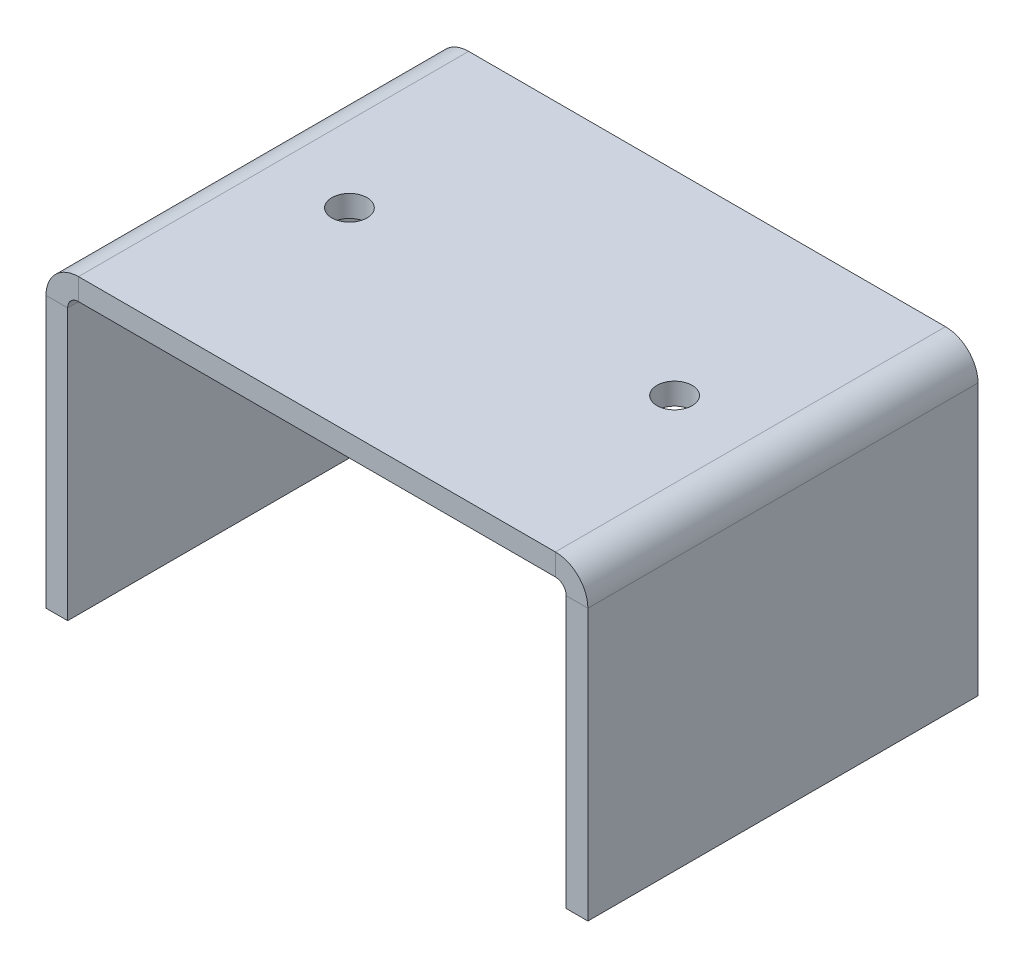
ISO-10303-21;
HEADER;
FILE_DESCRIPTION(('STEP AP214'),'2;1');
FILE_NAME('part.step','',(''),(''),'','','');
FILE_SCHEMA(('AUTOMOTIVE_DESIGN { 1 0 10303 214 1 1 1 1 }'));
ENDSEC;
DATA;
#1=APPLICATION_CONTEXT('core data for automotive mechanical design processes');
#2=APPLICATION_PROTOCOL_DEFINITION('international standard','automotive_design',2000,#1);
#3=PRODUCT_CONTEXT('',#1,'mechanical');
#4=PRODUCT('Part','Part','',(#3));
#5=PRODUCT_RELATED_PRODUCT_CATEGORY('part','',(#4));
#6=PRODUCT_DEFINITION_FORMATION('','',#4);
#7=PRODUCT_DEFINITION_CONTEXT('part definition',#1,'design');
#8=PRODUCT_DEFINITION('design','',#6,#7);
#9=PRODUCT_DEFINITION_SHAPE('','',#8);
#10=(LENGTH_UNIT() NAMED_UNIT(*) SI_UNIT(.MILLI.,.METRE.));
#11=(NAMED_UNIT(*) PLANE_ANGLE_UNIT() SI_UNIT($,.RADIAN.));
#12=(NAMED_UNIT(*) SI_UNIT($,.STERADIAN.) SOLID_ANGLE_UNIT());
#13=UNCERTAINTY_MEASURE_WITH_UNIT(LENGTH_MEASURE(1.E-05),#10,'distance_accuracy_value','');
#14=(GEOMETRIC_REPRESENTATION_CONTEXT(3) GLOBAL_UNCERTAINTY_ASSIGNED_CONTEXT((#13)) GLOBAL_UNIT_ASSIGNED_CONTEXT((#10,
#11,#12)) REPRESENTATION_CONTEXT('',''));
#15=CARTESIAN_POINT('',(0.,0.,0.));
#16=DIRECTION('',(0.,0.,1.));
#17=DIRECTION('',(1.,0.,0.));
#18=AXIS2_PLACEMENT_3D('',#15,#16,#17);
#19=CARTESIAN_POINT('',(-50.,-4.,36.));
#20=DIRECTION('',(0.,0.,1.));
#21=DIRECTION('',(1.,0.,0.));
#22=AXIS2_PLACEMENT_3D('',#19,#20,#21);
#23=PLANE('',#22);
#24=DIRECTION('',(0.,-1.,0.));
#25=VECTOR('',#24,1.);
#26=CARTESIAN_POINT('',(44.,-3.99999999999997,36.));
#27=LINE('',#26,#25);
#28=CARTESIAN_POINT('',(44.,0.,36.));
#29=VERTEX_POINT('',#28);
#30=CARTESIAN_POINT('',(44.,-3.99999999999997,36.));
#31=VERTEX_POINT('',#30);
#32=EDGE_CURVE('E11',#29,#31,#27,.T.);
#33=ORIENTED_EDGE('',*,*,#32,.F.);
#34=DIRECTION('',(-1.,0.,0.));
#35=VECTOR('',#34,1.);
#36=CARTESIAN_POINT('',(-50.,0.,36.));
#37=LINE('',#36,#35);
#38=CARTESIAN_POINT('',(-44.,0.,36.));
#39=VERTEX_POINT('',#38);
#40=EDGE_CURVE('E156',#39,#29,#37,.F.);
#41=ORIENTED_EDGE('',*,*,#40,.F.);
#42=DIRECTION('',(0.,-1.,0.));
#43=VECTOR('',#42,1.);
#44=CARTESIAN_POINT('',(-44.,-4.,36.));
#45=LINE('',#44,#43);
#46=CARTESIAN_POINT('',(-44.,-4.,36.));
#47=VERTEX_POINT('',#46);
#48=EDGE_CURVE('E49',#39,#47,#45,.T.);
#49=ORIENTED_EDGE('',*,*,#48,.T.);
#50=DIRECTION('',(1.,0.,0.));
#51=VECTOR('',#50,1.);
#52=CARTESIAN_POINT('',(-50.,-4.,36.));
#53=LINE('',#52,#51);
#54=EDGE_CURVE('E210',#47,#31,#53,.T.);
#55=ORIENTED_EDGE('',*,*,#54,.T.);
#56=EDGE_LOOP('',(#33,#41,#49,#55));
#57=FACE_BOUND('',#56,.T.);
#58=ADVANCED_FACE('F39',(#57),#23,.T.);
#59=CARTESIAN_POINT('',(-44.,-6.,36.));
#60=DIRECTION('',(0.,0.,1.));
#61=DIRECTION('',(1.,0.,0.));
#62=AXIS2_PLACEMENT_3D('',#59,#60,#61);
#63=PLANE('',#62);
#64=ORIENTED_EDGE('',*,*,#48,.F.);
#65=CARTESIAN_POINT('',(-44.,-6.,36.));
#66=DIRECTION('',(0.,0.,1.));
#67=DIRECTION('',(1.,0.,0.));
#68=AXIS2_PLACEMENT_3D('',#65,#66,#67);
#69=CIRCLE('',#68,6.);
#70=CARTESIAN_POINT('',(-50.,-6.,36.));
#71=VERTEX_POINT('',#70);
#72=EDGE_CURVE('E157',#39,#71,#69,.T.);
#73=ORIENTED_EDGE('',*,*,#72,.T.);
#74=DIRECTION('',(1.,0.,0.));
#75=VECTOR('',#74,1.);
#76=CARTESIAN_POINT('',(-46.,-6.,36.));
#77=LINE('',#76,#75);
#78=CARTESIAN_POINT('',(-46.,-6.,36.));
#79=VERTEX_POINT('',#78);
#80=EDGE_CURVE('E191',#71,#79,#77,.T.);
#81=ORIENTED_EDGE('',*,*,#80,.T.);
#82=CARTESIAN_POINT('',(-44.,-6.,36.));
#83=DIRECTION('',(0.,0.,-1.));
#84=DIRECTION('',(-1.,0.,0.));
#85=AXIS2_PLACEMENT_3D('',#82,#83,#84);
#86=CIRCLE('',#85,2.);
#87=EDGE_CURVE('E211',#47,#79,#86,.F.);
#88=ORIENTED_EDGE('',*,*,#87,.F.);
#89=EDGE_LOOP('',(#64,#73,#81,#88));
#90=FACE_BOUND('',#89,.T.);
#91=ADVANCED_FACE('F286',(#90),#63,.T.);
#92=CARTESIAN_POINT('',(-46.,-56.,36.));
#93=DIRECTION('',(0.,0.,1.));
#94=DIRECTION('',(0.,1.,0.));
#95=AXIS2_PLACEMENT_3D('',#92,#93,#94);
#96=PLANE('',#95);
#97=ORIENTED_EDGE('',*,*,#80,.F.);
#98=DIRECTION('',(0.,-1.,0.));
#99=VECTOR('',#98,1.);
#100=CARTESIAN_POINT('',(-50.,-56.,36.));
#101=LINE('',#100,#99);
#102=CARTESIAN_POINT('',(-50.,-56.,36.));
#103=VERTEX_POINT('',#102);
#104=EDGE_CURVE('E163',#103,#71,#101,.F.);
#105=ORIENTED_EDGE('',*,*,#104,.F.);
#106=DIRECTION('',(1.,0.,0.));
#107=VECTOR('',#106,1.);
#108=CARTESIAN_POINT('',(-46.,-56.,36.));
#109=LINE('',#108,#107);
#110=CARTESIAN_POINT('',(-46.,-56.,36.));
#111=VERTEX_POINT('',#110);
#112=EDGE_CURVE('E188',#103,#111,#109,.T.);
#113=ORIENTED_EDGE('',*,*,#112,.T.);
#114=DIRECTION('',(0.,1.,0.));
#115=VECTOR('',#114,1.);
#116=CARTESIAN_POINT('',(-46.,-56.,36.));
#117=LINE('',#116,#115);
#118=EDGE_CURVE('E216',#111,#79,#117,.T.);
#119=ORIENTED_EDGE('',*,*,#118,.T.);
#120=EDGE_LOOP('',(#97,#105,#113,#119));
#121=FACE_BOUND('',#120,.T.);
#122=ADVANCED_FACE('F295',(#121),#96,.T.);
#123=CARTESIAN_POINT('',(-46.,-56.,36.));
#124=DIRECTION('',(0.,1.,0.));
#125=DIRECTION('',(0.,0.,-1.));
#126=AXIS2_PLACEMENT_3D('',#123,#124,#125);
#127=PLANE('',#126);
#128=ORIENTED_EDGE('',*,*,#112,.F.);
#129=DIRECTION('',(0.,0.,1.));
#130=VECTOR('',#129,1.);
#131=CARTESIAN_POINT('',(-50.,-56.,36.));
#132=LINE('',#131,#130);
#133=CARTESIAN_POINT('',(-50.,-56.,-36.));
#134=VERTEX_POINT('',#133);
#135=EDGE_CURVE('E151',#103,#134,#132,.F.);
#136=ORIENTED_EDGE('',*,*,#135,.T.);
#137=DIRECTION('',(1.,0.,0.));
#138=VECTOR('',#137,1.);
#139=CARTESIAN_POINT('',(-46.,-56.,-36.));
#140=LINE('',#139,#138);
#141=CARTESIAN_POINT('',(-46.,-56.,-36.));
#142=VERTEX_POINT('',#141);
#143=EDGE_CURVE('E185',#134,#142,#140,.T.);
#144=ORIENTED_EDGE('',*,*,#143,.T.);
#145=DIRECTION('',(0.,0.,-1.));
#146=VECTOR('',#145,1.);
#147=CARTESIAN_POINT('',(-46.,-56.,36.));
#148=LINE('',#147,#146);
#149=EDGE_CURVE('E219',#111,#142,#148,.T.);
#150=ORIENTED_EDGE('',*,*,#149,.F.);
#151=EDGE_LOOP('',(#128,#136,#144,#150));
#152=FACE_BOUND('',#151,.T.);
#153=ADVANCED_FACE('F336',(#152),#127,.F.);
#154=CARTESIAN_POINT('',(-46.,-56.,-36.));
#155=DIRECTION('',(0.,0.,1.));
#156=DIRECTION('',(0.,1.,0.));
#157=AXIS2_PLACEMENT_3D('',#154,#155,#156);
#158=PLANE('',#157);
#159=ORIENTED_EDGE('',*,*,#143,.F.);
#160=DIRECTION('',(0.,-1.,0.));
#161=VECTOR('',#160,1.);
#162=CARTESIAN_POINT('',(-50.,-56.,-36.));
#163=LINE('',#162,#161);
#164=CARTESIAN_POINT('',(-50.,-6.,-36.));
#165=VERTEX_POINT('',#164);
#166=EDGE_CURVE('E160',#134,#165,#163,.F.);
#167=ORIENTED_EDGE('',*,*,#166,.T.);
#168=DIRECTION('',(1.,0.,0.));
#169=VECTOR('',#168,1.);
#170=CARTESIAN_POINT('',(-46.,-6.,-36.));
#171=LINE('',#170,#169);
#172=CARTESIAN_POINT('',(-46.,-6.,-36.));
#173=VERTEX_POINT('',#172);
#174=EDGE_CURVE('E182',#165,#173,#171,.T.);
#175=ORIENTED_EDGE('',*,*,#174,.T.);
#176=DIRECTION('',(0.,1.,0.));
#177=VECTOR('',#176,1.);
#178=CARTESIAN_POINT('',(-46.,-56.,-36.));
#179=LINE('',#178,#177);
#180=EDGE_CURVE('E213',#142,#173,#179,.T.);
#181=ORIENTED_EDGE('',*,*,#180,.F.);
#182=EDGE_LOOP('',(#159,#167,#175,#181));
#183=FACE_BOUND('',#182,.T.);
#184=ADVANCED_FACE('F339',(#183),#158,.F.);
#185=CARTESIAN_POINT('',(-44.,-6.,-36.));
#186=DIRECTION('',(0.,0.,-1.));
#187=DIRECTION('',(-1.,0.,0.));
#188=AXIS2_PLACEMENT_3D('',#185,#186,#187);
#189=PLANE('',#188);
#190=ORIENTED_EDGE('',*,*,#174,.F.);
#191=CARTESIAN_POINT('',(-44.,-6.,-36.));
#192=DIRECTION('',(0.,0.,1.));
#193=DIRECTION('',(1.,0.,0.));
#194=AXIS2_PLACEMENT_3D('',#191,#192,#193);
#195=CIRCLE('',#194,6.);
#196=CARTESIAN_POINT('',(-44.,0.,-36.));
#197=VERTEX_POINT('',#196);
#198=EDGE_CURVE('E136',#165,#197,#195,.F.);
#199=ORIENTED_EDGE('',*,*,#198,.T.);
#200=DIRECTION('',(0.,-1.,0.));
#201=VECTOR('',#200,1.);
#202=CARTESIAN_POINT('',(-44.,-4.,-36.));
#203=LINE('',#202,#201);
#204=CARTESIAN_POINT('',(-44.,-4.,-36.));
#205=VERTEX_POINT('',#204);
#206=EDGE_CURVE('E179',#197,#205,#203,.T.);
#207=ORIENTED_EDGE('',*,*,#206,.T.);
#208=CARTESIAN_POINT('',(-44.,-6.,-36.));
#209=DIRECTION('',(0.,0.,1.));
#210=DIRECTION('',(1.,0.,0.));
#211=AXIS2_PLACEMENT_3D('',#208,#209,#210);
#212=CIRCLE('',#211,2.);
#213=EDGE_CURVE('E237',#173,#205,#212,.F.);
#214=ORIENTED_EDGE('',*,*,#213,.F.);
#215=EDGE_LOOP('',(#190,#199,#207,#214));
#216=FACE_BOUND('',#215,.T.);
#217=ADVANCED_FACE('F303',(#216),#189,.T.);
#218=CARTESIAN_POINT('',(-50.,-4.,-36.));
#219=DIRECTION('',(0.,0.,1.));
#220=DIRECTION('',(1.,0.,0.));
#221=AXIS2_PLACEMENT_3D('',#218,#219,#220);
#222=PLANE('',#221);
#223=ORIENTED_EDGE('',*,*,#206,.F.);
#224=DIRECTION('',(-1.,0.,0.));
#225=VECTOR('',#224,1.);
#226=CARTESIAN_POINT('',(-50.,0.,-36.));
#227=LINE('',#226,#225);
#228=CARTESIAN_POINT('',(44.,0.,-36.));
#229=VERTEX_POINT('',#228);
#230=EDGE_CURVE('E154',#197,#229,#227,.F.);
#231=ORIENTED_EDGE('',*,*,#230,.T.);
#232=DIRECTION('',(0.,-1.,0.));
#233=VECTOR('',#232,1.);
#234=CARTESIAN_POINT('',(44.,-3.99999999999997,-36.));
#235=LINE('',#234,#233);
#236=CARTESIAN_POINT('',(44.,-3.99999999999997,-36.));
#237=VERTEX_POINT('',#236);
#238=EDGE_CURVE('E58',#229,#237,#235,.T.);
#239=ORIENTED_EDGE('',*,*,#238,.T.);
#240=DIRECTION('',(1.,0.,0.));
#241=VECTOR('',#240,1.);
#242=CARTESIAN_POINT('',(-50.,-4.,-36.));
#243=LINE('',#242,#241);
#244=EDGE_CURVE('E208',#205,#237,#243,.T.);
#245=ORIENTED_EDGE('',*,*,#244,.F.);
#246=EDGE_LOOP('',(#223,#231,#239,#245));
#247=FACE_BOUND('',#246,.T.);
#248=ADVANCED_FACE('F306',(#247),#222,.F.);
#249=CARTESIAN_POINT('',(44.,-5.99999999999997,-36.));
#250=DIRECTION('',(0.,0.,-1.));
#251=DIRECTION('',(-1.,0.,0.));
#252=AXIS2_PLACEMENT_3D('',#249,#250,#251);
#253=PLANE('',#252);
#254=ORIENTED_EDGE('',*,*,#238,.F.);
#255=CARTESIAN_POINT('',(44.,-5.99999999999997,-36.));
#256=DIRECTION('',(0.,0.,1.));
#257=DIRECTION('',(1.,0.,0.));
#258=AXIS2_PLACEMENT_3D('',#255,#256,#257);
#259=CIRCLE('',#258,6.);
#260=CARTESIAN_POINT('',(50.,-5.99999999999997,-36.));
#261=VERTEX_POINT('',#260);
#262=EDGE_CURVE('E137',#229,#261,#259,.F.);
#263=ORIENTED_EDGE('',*,*,#262,.T.);
#264=DIRECTION('',(-1.,0.,0.));
#265=VECTOR('',#264,1.);
#266=CARTESIAN_POINT('',(46.,-5.99999999999997,-36.));
#267=LINE('',#266,#265);
#268=CARTESIAN_POINT('',(46.,-5.99999999999997,-36.));
#269=VERTEX_POINT('',#268);
#270=EDGE_CURVE('E175',#261,#269,#267,.T.);
#271=ORIENTED_EDGE('',*,*,#270,.T.);
#272=CARTESIAN_POINT('',(44.,-5.99999999999997,-36.));
#273=DIRECTION('',(0.,0.,1.));
#274=DIRECTION('',(1.,0.,0.));
#275=AXIS2_PLACEMENT_3D('',#272,#273,#274);
#276=CIRCLE('',#275,2.);
#277=EDGE_CURVE('E246',#237,#269,#276,.F.);
#278=ORIENTED_EDGE('',*,*,#277,.F.);
#279=EDGE_LOOP('',(#254,#263,#271,#278));
#280=FACE_BOUND('',#279,.T.);
#281=ADVANCED_FACE('F263',(#280),#253,.T.);
#282=CARTESIAN_POINT('',(46.,0.,-36.));
#283=DIRECTION('',(0.,0.,1.));
#284=DIRECTION('',(0.,-1.,0.));
#285=AXIS2_PLACEMENT_3D('',#282,#283,#284);
#286=PLANE('',#285);
#287=ORIENTED_EDGE('',*,*,#270,.F.);
#288=DIRECTION('',(0.,1.,0.));
#289=VECTOR('',#288,1.);
#290=CARTESIAN_POINT('',(50.,0.,-36.));
#291=LINE('',#290,#289);
#292=CARTESIAN_POINT('',(50.,-56.,-36.));
#293=VERTEX_POINT('',#292);
#294=EDGE_CURVE('E126',#261,#293,#291,.F.);
#295=ORIENTED_EDGE('',*,*,#294,.T.);
#296=DIRECTION('',(-1.,0.,0.));
#297=VECTOR('',#296,1.);
#298=CARTESIAN_POINT('',(46.,-56.,-36.));
#299=LINE('',#298,#297);
#300=CARTESIAN_POINT('',(46.,-56.,-36.));
#301=VERTEX_POINT('',#300);
#302=EDGE_CURVE('E172',#293,#301,#299,.T.);
#303=ORIENTED_EDGE('',*,*,#302,.T.);
#304=DIRECTION('',(0.,-1.,0.));
#305=VECTOR('',#304,1.);
#306=CARTESIAN_POINT('',(46.,0.,-36.));
#307=LINE('',#306,#305);
#308=EDGE_CURVE('E222',#269,#301,#307,.T.);
#309=ORIENTED_EDGE('',*,*,#308,.F.);
#310=EDGE_LOOP('',(#287,#295,#303,#309));
#311=FACE_BOUND('',#310,.T.);
#312=ADVANCED_FACE('F269',(#311),#286,.F.);
#313=CARTESIAN_POINT('',(46.,-56.,36.));
#314=DIRECTION('',(0.,-1.,0.));
#315=DIRECTION('',(0.,0.,-1.));
#316=AXIS2_PLACEMENT_3D('',#313,#314,#315);
#317=PLANE('',#316);
#318=ORIENTED_EDGE('',*,*,#302,.F.);
#319=DIRECTION('',(0.,0.,1.));
#320=VECTOR('',#319,1.);
#321=CARTESIAN_POINT('',(50.,-56.,36.));
#322=LINE('',#321,#320);
#323=CARTESIAN_POINT('',(50.,-56.,36.));
#324=VERTEX_POINT('',#323);
#325=EDGE_CURVE('E143',#324,#293,#322,.F.);
#326=ORIENTED_EDGE('',*,*,#325,.F.);
#327=DIRECTION('',(-1.,0.,0.));
#328=VECTOR('',#327,1.);
#329=CARTESIAN_POINT('',(46.,-56.,36.));
#330=LINE('',#329,#328);
#331=CARTESIAN_POINT('',(46.,-56.,36.));
#332=VERTEX_POINT('',#331);
#333=EDGE_CURVE('E114',#324,#332,#330,.T.);
#334=ORIENTED_EDGE('',*,*,#333,.T.);
#335=DIRECTION('',(0.,0.,-1.));
#336=VECTOR('',#335,1.);
#337=CARTESIAN_POINT('',(46.,-56.,36.));
#338=LINE('',#337,#336);
#339=EDGE_CURVE('E225',#332,#301,#338,.T.);
#340=ORIENTED_EDGE('',*,*,#339,.T.);
#341=EDGE_LOOP('',(#318,#326,#334,#340));
#342=FACE_BOUND('',#341,.T.);
#343=ADVANCED_FACE('F351',(#342),#317,.T.);
#344=CARTESIAN_POINT('',(46.,0.,36.));
#345=DIRECTION('',(0.,0.,1.));
#346=DIRECTION('',(0.,-1.,0.));
#347=AXIS2_PLACEMENT_3D('',#344,#345,#346);
#348=PLANE('',#347);
#349=ORIENTED_EDGE('',*,*,#333,.F.);
#350=DIRECTION('',(0.,1.,0.));
#351=VECTOR('',#350,1.);
#352=CARTESIAN_POINT('',(50.,0.,36.));
#353=LINE('',#352,#351);
#354=CARTESIAN_POINT('',(50.,-5.99999999999997,36.));
#355=VERTEX_POINT('',#354);
#356=EDGE_CURVE('E124',#355,#324,#353,.F.);
#357=ORIENTED_EDGE('',*,*,#356,.F.);
#358=DIRECTION('',(-1.,0.,0.));
#359=VECTOR('',#358,1.);
#360=CARTESIAN_POINT('',(46.,-5.99999999999997,36.));
#361=LINE('',#360,#359);
#362=CARTESIAN_POINT('',(46.,-5.99999999999997,36.));
#363=VERTEX_POINT('',#362);
#364=EDGE_CURVE('E104',#355,#363,#361,.T.);
#365=ORIENTED_EDGE('',*,*,#364,.T.);
#366=DIRECTION('',(0.,-1.,0.));
#367=VECTOR('',#366,1.);
#368=CARTESIAN_POINT('',(46.,0.,36.));
#369=LINE('',#368,#367);
#370=EDGE_CURVE('E228',#363,#332,#369,.T.);
#371=ORIENTED_EDGE('',*,*,#370,.T.);
#372=EDGE_LOOP('',(#349,#357,#365,#371));
#373=FACE_BOUND('',#372,.T.);
#374=ADVANCED_FACE('F139',(#373),#348,.T.);
#375=CARTESIAN_POINT('',(44.,-5.99999999999997,36.));
#376=DIRECTION('',(0.,0.,1.));
#377=DIRECTION('',(1.,0.,0.));
#378=AXIS2_PLACEMENT_3D('',#375,#376,#377);
#379=PLANE('',#378);
#380=CARTESIAN_POINT('',(44.,-5.99999999999997,36.));
#381=DIRECTION('',(0.,0.,1.));
#382=DIRECTION('',(1.,0.,0.));
#383=AXIS2_PLACEMENT_3D('',#380,#381,#382);
#384=CIRCLE('',#383,6.);
#385=EDGE_CURVE('E107',#355,#29,#384,.T.);
#386=ORIENTED_EDGE('',*,*,#385,.T.);
#387=ORIENTED_EDGE('',*,*,#32,.T.);
#388=CARTESIAN_POINT('',(44.,-5.99999999999997,36.));
#389=DIRECTION('',(0.,0.,-1.));
#390=DIRECTION('',(-1.,0.,0.));
#391=AXIS2_PLACEMENT_3D('',#388,#389,#390);
#392=CIRCLE('',#391,2.);
#393=EDGE_CURVE('E109',#363,#31,#392,.F.);
#394=ORIENTED_EDGE('',*,*,#393,.F.);
#395=ORIENTED_EDGE('',*,*,#364,.F.);
#396=EDGE_LOOP('',(#386,#387,#394,#395));
#397=FACE_BOUND('',#396,.T.);
#398=ADVANCED_FACE('F41',(#397),#379,.T.);
#399=CARTESIAN_POINT('',(46.,0.,36.));
#400=DIRECTION('',(1.,0.,0.));
#401=DIRECTION('',(0.,1.,0.));
#402=AXIS2_PLACEMENT_3D('',#399,#400,#401);
#403=PLANE('',#402);
#404=ORIENTED_EDGE('',*,*,#370,.F.);
#405=DIRECTION('',(0.,0.,-1.));
#406=VECTOR('',#405,1.);
#407=CARTESIAN_POINT('',(46.,-5.99999999999997,-36.));
#408=LINE('',#407,#406);
#409=EDGE_CURVE('E236',#363,#269,#408,.T.);
#410=ORIENTED_EDGE('',*,*,#409,.T.);
#411=ORIENTED_EDGE('',*,*,#308,.T.);
#412=ORIENTED_EDGE('',*,*,#339,.F.);
#413=EDGE_LOOP('',(#404,#410,#411,#412));
#414=FACE_BOUND('',#413,.T.);
#415=ADVANCED_FACE('F273',(#414),#403,.F.);
#416=CARTESIAN_POINT('',(-46.,-56.,36.));
#417=DIRECTION('',(-1.,0.,0.));
#418=DIRECTION('',(0.,-1.,0.));
#419=AXIS2_PLACEMENT_3D('',#416,#417,#418);
#420=PLANE('',#419);
#421=ORIENTED_EDGE('',*,*,#180,.T.);
#422=DIRECTION('',(0.,0.,-1.));
#423=VECTOR('',#422,1.);
#424=CARTESIAN_POINT('',(-46.,-6.,36.));
#425=LINE('',#424,#423);
#426=EDGE_CURVE('E233',#173,#79,#425,.F.);
#427=ORIENTED_EDGE('',*,*,#426,.T.);
#428=ORIENTED_EDGE('',*,*,#118,.F.);
#429=ORIENTED_EDGE('',*,*,#149,.T.);
#430=EDGE_LOOP('',(#421,#427,#428,#429));
#431=FACE_BOUND('',#430,.T.);
#432=ADVANCED_FACE('F298',(#431),#420,.F.);
#433=CARTESIAN_POINT('',(-50.,-4.,36.));
#434=DIRECTION('',(0.,1.,0.));
#435=DIRECTION('',(-1.,0.,0.));
#436=AXIS2_PLACEMENT_3D('',#433,#434,#435);
#437=PLANE('',#436);
#438=CARTESIAN_POINT('',(-30.,-3.99999999999999,0.));
#439=DIRECTION('',(0.,1.,0.));
#440=DIRECTION('',(-1.,0.,0.));
#441=AXIS2_PLACEMENT_3D('',#438,#439,#440);
#442=CIRCLE('',#441,3.24999999999997);
#443=CARTESIAN_POINT('',(-33.25,-4.,0.));
#444=VERTEX_POINT('',#443);
#445=EDGE_CURVE('E197',#444,#444,#442,.T.);
#446=ORIENTED_EDGE('',*,*,#445,.T.);
#447=EDGE_LOOP('',(#446));
#448=FACE_BOUND('',#447,.T.);
#449=CARTESIAN_POINT('',(30.,-3.99999999999998,0.));
#450=DIRECTION('',(0.,1.,0.));
#451=DIRECTION('',(-1.,0.,0.));
#452=AXIS2_PLACEMENT_3D('',#449,#450,#451);
#453=CIRCLE('',#452,3.24999999999997);
#454=CARTESIAN_POINT('',(26.75,-3.99999999999998,0.));
#455=VERTEX_POINT('',#454);
#456=EDGE_CURVE('E153',#455,#455,#453,.T.);
#457=ORIENTED_EDGE('',*,*,#456,.T.);
#458=EDGE_LOOP('',(#457));
#459=FACE_BOUND('',#458,.T.);
#460=ORIENTED_EDGE('',*,*,#244,.T.);
#461=DIRECTION('',(0.,0.,-1.));
#462=VECTOR('',#461,1.);
#463=CARTESIAN_POINT('',(44.,-3.99999999999997,36.));
#464=LINE('',#463,#462);
#465=EDGE_CURVE('E115',#237,#31,#464,.F.);
#466=ORIENTED_EDGE('',*,*,#465,.T.);
#467=ORIENTED_EDGE('',*,*,#54,.F.);
#468=DIRECTION('',(0.,0.,-1.));
#469=VECTOR('',#468,1.);
#470=CARTESIAN_POINT('',(-44.,-4.,-36.));
#471=LINE('',#470,#469);
#472=EDGE_CURVE('E230',#47,#205,#471,.T.);
#473=ORIENTED_EDGE('',*,*,#472,.T.);
#474=EDGE_LOOP('',(#460,#466,#467,#473));
#475=FACE_BOUND('',#474,.T.);
#476=ADVANCED_FACE('F258',(#448,#459,#475),#437,.F.);
#477=CARTESIAN_POINT('',(-44.,-6.,36.));
#478=DIRECTION('',(0.,0.,1.));
#479=DIRECTION('',(1.,0.,0.));
#480=AXIS2_PLACEMENT_3D('',#477,#478,#479);
#481=CYLINDRICAL_SURFACE('',#480,2.);
#482=ORIENTED_EDGE('',*,*,#87,.T.);
#483=ORIENTED_EDGE('',*,*,#426,.F.);
#484=ORIENTED_EDGE('',*,*,#213,.T.);
#485=ORIENTED_EDGE('',*,*,#472,.F.);
#486=EDGE_LOOP('',(#482,#483,#484,#485));
#487=FACE_BOUND('',#486,.T.);
#488=ADVANCED_FACE('F293',(#487),#481,.F.);
#489=CARTESIAN_POINT('',(44.,-5.99999999999997,36.));
#490=DIRECTION('',(0.,0.,1.));
#491=DIRECTION('',(1.,0.,0.));
#492=AXIS2_PLACEMENT_3D('',#489,#490,#491);
#493=CYLINDRICAL_SURFACE('',#492,2.);
#494=ORIENTED_EDGE('',*,*,#393,.T.);
#495=ORIENTED_EDGE('',*,*,#465,.F.);
#496=ORIENTED_EDGE('',*,*,#277,.T.);
#497=ORIENTED_EDGE('',*,*,#409,.F.);
#498=EDGE_LOOP('',(#494,#495,#496,#497));
#499=FACE_BOUND('',#498,.T.);
#500=ADVANCED_FACE('F253',(#499),#493,.F.);
#501=CARTESIAN_POINT('',(50.,0.,36.));
#502=DIRECTION('',(1.,0.,0.));
#503=DIRECTION('',(0.,1.,0.));
#504=AXIS2_PLACEMENT_3D('',#501,#502,#503);
#505=PLANE('',#504);
#506=ORIENTED_EDGE('',*,*,#356,.T.);
#507=ORIENTED_EDGE('',*,*,#325,.T.);
#508=ORIENTED_EDGE('',*,*,#294,.F.);
#509=DIRECTION('',(0.,0.,1.));
#510=VECTOR('',#509,1.);
#511=CARTESIAN_POINT('',(50.,-5.99999999999997,36.));
#512=LINE('',#511,#510);
#513=EDGE_CURVE('E121',#355,#261,#512,.F.);
#514=ORIENTED_EDGE('',*,*,#513,.F.);
#515=EDGE_LOOP('',(#506,#507,#508,#514));
#516=FACE_BOUND('',#515,.T.);
#517=ADVANCED_FACE('F122',(#516),#505,.T.);
#518=CARTESIAN_POINT('',(-50.,-56.,36.));
#519=DIRECTION('',(-1.,0.,0.));
#520=DIRECTION('',(0.,-1.,0.));
#521=AXIS2_PLACEMENT_3D('',#518,#519,#520);
#522=PLANE('',#521);
#523=ORIENTED_EDGE('',*,*,#166,.F.);
#524=ORIENTED_EDGE('',*,*,#135,.F.);
#525=ORIENTED_EDGE('',*,*,#104,.T.);
#526=DIRECTION('',(0.,0.,1.));
#527=VECTOR('',#526,1.);
#528=CARTESIAN_POINT('',(-50.,-6.,36.));
#529=LINE('',#528,#527);
#530=EDGE_CURVE('E131',#165,#71,#529,.T.);
#531=ORIENTED_EDGE('',*,*,#530,.F.);
#532=EDGE_LOOP('',(#523,#524,#525,#531));
#533=FACE_BOUND('',#532,.T.);
#534=ADVANCED_FACE('F314',(#533),#522,.T.);
#535=CARTESIAN_POINT('',(-50.,0.,36.));
#536=DIRECTION('',(0.,1.,0.));
#537=DIRECTION('',(-1.,0.,0.));
#538=AXIS2_PLACEMENT_3D('',#535,#536,#537);
#539=PLANE('',#538);
#540=CARTESIAN_POINT('',(-30.,0.,0.));
#541=DIRECTION('',(0.,1.,0.));
#542=DIRECTION('',(-1.,0.,0.));
#543=AXIS2_PLACEMENT_3D('',#540,#541,#542);
#544=CIRCLE('',#543,3.24999999999997);
#545=CARTESIAN_POINT('',(-33.25,0.,0.));
#546=VERTEX_POINT('',#545);
#547=EDGE_CURVE('E43',#546,#546,#544,.T.);
#548=ORIENTED_EDGE('',*,*,#547,.F.);
#549=EDGE_LOOP('',(#548));
#550=FACE_BOUND('',#549,.T.);
#551=CARTESIAN_POINT('',(30.,0.,0.));
#552=DIRECTION('',(0.,1.,0.));
#553=DIRECTION('',(-1.,0.,0.));
#554=AXIS2_PLACEMENT_3D('',#551,#552,#553);
#555=CIRCLE('',#554,3.24999999999997);
#556=CARTESIAN_POINT('',(26.75,0.,0.));
#557=VERTEX_POINT('',#556);
#558=EDGE_CURVE('E195',#557,#557,#555,.T.);
#559=ORIENTED_EDGE('',*,*,#558,.F.);
#560=EDGE_LOOP('',(#559));
#561=FACE_BOUND('',#560,.T.);
#562=ORIENTED_EDGE('',*,*,#230,.F.);
#563=DIRECTION('',(0.,0.,1.));
#564=VECTOR('',#563,1.);
#565=CARTESIAN_POINT('',(-44.,0.,36.));
#566=LINE('',#565,#564);
#567=EDGE_CURVE('E142',#39,#197,#566,.F.);
#568=ORIENTED_EDGE('',*,*,#567,.F.);
#569=ORIENTED_EDGE('',*,*,#40,.T.);
#570=DIRECTION('',(0.,0.,1.));
#571=VECTOR('',#570,1.);
#572=CARTESIAN_POINT('',(44.,0.,36.));
#573=LINE('',#572,#571);
#574=EDGE_CURVE('E130',#229,#29,#573,.T.);
#575=ORIENTED_EDGE('',*,*,#574,.F.);
#576=EDGE_LOOP('',(#562,#568,#569,#575));
#577=FACE_BOUND('',#576,.T.);
#578=ADVANCED_FACE('F312',(#550,#561,#577),#539,.T.);
#579=CARTESIAN_POINT('',(-44.,-6.,36.));
#580=DIRECTION('',(0.,0.,1.));
#581=DIRECTION('',(1.,0.,0.));
#582=AXIS2_PLACEMENT_3D('',#579,#580,#581);
#583=CYLINDRICAL_SURFACE('',#582,6.);
#584=ORIENTED_EDGE('',*,*,#72,.F.);
#585=ORIENTED_EDGE('',*,*,#567,.T.);
#586=ORIENTED_EDGE('',*,*,#198,.F.);
#587=ORIENTED_EDGE('',*,*,#530,.T.);
#588=EDGE_LOOP('',(#584,#585,#586,#587));
#589=FACE_BOUND('',#588,.T.);
#590=ADVANCED_FACE('F310',(#589),#583,.T.);
#591=CARTESIAN_POINT('',(44.,-5.99999999999997,36.));
#592=DIRECTION('',(0.,0.,1.));
#593=DIRECTION('',(1.,0.,0.));
#594=AXIS2_PLACEMENT_3D('',#591,#592,#593);
#595=CYLINDRICAL_SURFACE('',#594,6.);
#596=ORIENTED_EDGE('',*,*,#385,.F.);
#597=ORIENTED_EDGE('',*,*,#513,.T.);
#598=ORIENTED_EDGE('',*,*,#262,.F.);
#599=ORIENTED_EDGE('',*,*,#574,.T.);
#600=EDGE_LOOP('',(#596,#597,#598,#599));
#601=FACE_BOUND('',#600,.T.);
#602=ADVANCED_FACE('F133',(#601),#595,.T.);
#603=CARTESIAN_POINT('',(30.,4.00000000000007,0.));
#604=DIRECTION('',(0.,1.,0.));
#605=DIRECTION('',(0.,0.,1.));
#606=AXIS2_PLACEMENT_3D('',#603,#604,#605);
#607=CYLINDRICAL_SURFACE('',#606,3.24999999999997);
#608=ORIENTED_EDGE('',*,*,#558,.T.);
#609=EDGE_LOOP('',(#608));
#610=FACE_BOUND('',#609,.T.);
#611=ORIENTED_EDGE('',*,*,#456,.F.);
#612=EDGE_LOOP('',(#611));
#613=FACE_BOUND('',#612,.T.);
#614=ADVANCED_FACE('F357',(#610,#613),#607,.F.);
#615=CARTESIAN_POINT('',(-30.,4.00000000000007,0.));
#616=DIRECTION('',(0.,1.,0.));
#617=DIRECTION('',(0.,0.,1.));
#618=AXIS2_PLACEMENT_3D('',#615,#616,#617);
#619=CYLINDRICAL_SURFACE('',#618,3.24999999999997);
#620=ORIENTED_EDGE('',*,*,#547,.T.);
#621=EDGE_LOOP('',(#620));
#622=FACE_BOUND('',#621,.T.);
#623=ORIENTED_EDGE('',*,*,#445,.F.);
#624=EDGE_LOOP('',(#623));
#625=FACE_BOUND('',#624,.T.);
#626=ADVANCED_FACE('F361',(#622,#625),#619,.F.);
#627=CLOSED_SHELL('',(#58,#91,#122,#153,#184,#217,#248,#281,#312,#343,#374,#398,#415,#432,#476,
#488,#500,#517,#534,#578,#590,#602,#614,#626));
#628=MANIFOLD_SOLID_BREP('B2',#627);
#629=ADVANCED_BREP_SHAPE_REPRESENTATION('',(#18,#628),#14);
#630=SHAPE_DEFINITION_REPRESENTATION(#9,#629);
ENDSEC;
END-ISO-10303-21;
